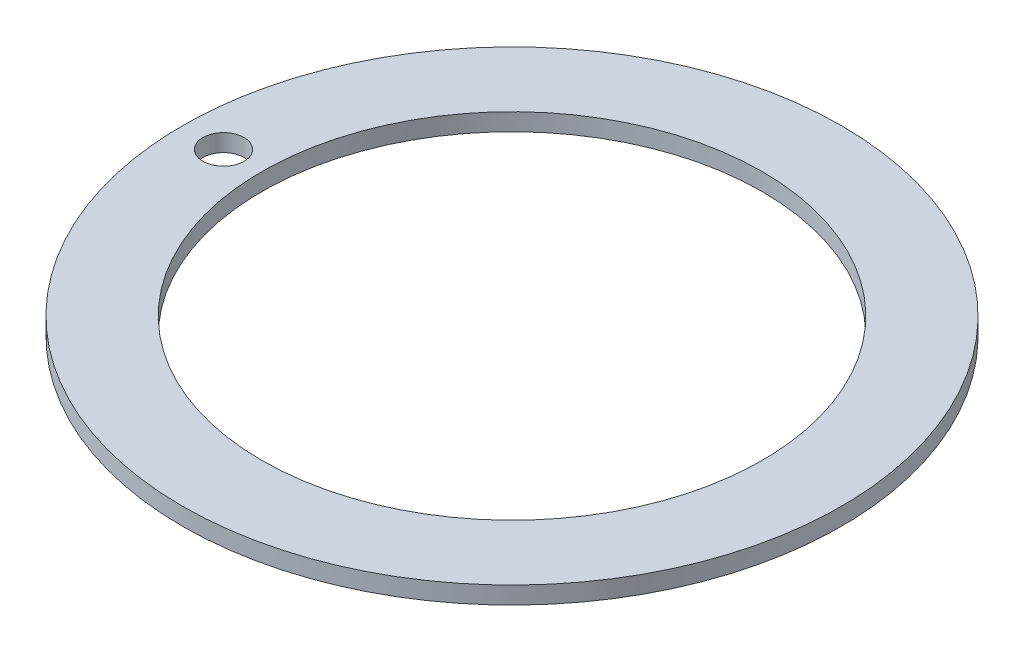
ISO-10303-21;
HEADER;
FILE_DESCRIPTION(('STEP AP214'),'2;1');
FILE_NAME('part.step','',(''),(''),'','','');
FILE_SCHEMA(('AUTOMOTIVE_DESIGN { 1 0 10303 214 1 1 1 1 }'));
ENDSEC;
DATA;
#1=APPLICATION_CONTEXT('core data for automotive mechanical design processes');
#2=APPLICATION_PROTOCOL_DEFINITION('international standard','automotive_design',2000,#1);
#3=PRODUCT_CONTEXT('',#1,'mechanical');
#4=PRODUCT('Part','Part','',(#3));
#5=PRODUCT_RELATED_PRODUCT_CATEGORY('part','',(#4));
#6=PRODUCT_DEFINITION_FORMATION('','',#4);
#7=PRODUCT_DEFINITION_CONTEXT('part definition',#1,'design');
#8=PRODUCT_DEFINITION('design','',#6,#7);
#9=PRODUCT_DEFINITION_SHAPE('','',#8);
#10=(LENGTH_UNIT() NAMED_UNIT(*) SI_UNIT(.MILLI.,.METRE.));
#11=(NAMED_UNIT(*) PLANE_ANGLE_UNIT() SI_UNIT($,.RADIAN.));
#12=(NAMED_UNIT(*) SI_UNIT($,.STERADIAN.) SOLID_ANGLE_UNIT());
#13=UNCERTAINTY_MEASURE_WITH_UNIT(LENGTH_MEASURE(1.E-05),#10,'distance_accuracy_value','');
#14=(GEOMETRIC_REPRESENTATION_CONTEXT(3) GLOBAL_UNCERTAINTY_ASSIGNED_CONTEXT((#13)) GLOBAL_UNIT_ASSIGNED_CONTEXT((#10,
#11,#12)) REPRESENTATION_CONTEXT('',''));
#15=CARTESIAN_POINT('',(0.,0.,0.));
#16=DIRECTION('',(0.,0.,1.));
#17=DIRECTION('',(1.,0.,0.));
#18=AXIS2_PLACEMENT_3D('',#15,#16,#17);
#19=CARTESIAN_POINT('',(0.,2.0066,0.));
#20=DIRECTION('',(0.,1.,0.));
#21=DIRECTION('',(0.,0.,1.));
#22=AXIS2_PLACEMENT_3D('',#19,#20,#21);
#23=PLANE('',#22);
#24=CARTESIAN_POINT('',(-33.3299411428324,2.0066,0.));
#25=DIRECTION('',(0.,1.,0.));
#26=DIRECTION('',(0.,0.,1.));
#27=AXIS2_PLACEMENT_3D('',#24,#25,#26);
#28=CIRCLE('',#27,2.38125);
#29=CARTESIAN_POINT('',(-33.3299411428324,2.0066,2.38125));
#30=VERTEX_POINT('',#29);
#31=EDGE_CURVE('E59',#30,#30,#28,.T.);
#32=ORIENTED_EDGE('',*,*,#31,.F.);
#33=EDGE_LOOP('',(#32));
#34=FACE_BOUND('',#33,.T.);
#35=CARTESIAN_POINT('',(0.,2.0066,0.));
#36=DIRECTION('',(0.,1.,0.));
#37=DIRECTION('',(0.,0.,1.));
#38=AXIS2_PLACEMENT_3D('',#35,#36,#37);
#39=CIRCLE('',#38,38.0746);
#40=CARTESIAN_POINT('',(0.,2.0066,38.0746));
#41=VERTEX_POINT('',#40);
#42=EDGE_CURVE('E10',#41,#41,#39,.T.);
#43=ORIENTED_EDGE('',*,*,#42,.T.);
#44=EDGE_LOOP('',(#43));
#45=FACE_BOUND('',#44,.T.);
#46=CARTESIAN_POINT('',(0.,2.0066,0.));
#47=DIRECTION('',(0.,1.,0.));
#48=DIRECTION('',(0.,0.,1.));
#49=AXIS2_PLACEMENT_3D('',#46,#47,#48);
#50=CIRCLE('',#49,28.9052);
#51=CARTESIAN_POINT('',(0.,2.0066,28.9052));
#52=VERTEX_POINT('',#51);
#53=EDGE_CURVE('E52',#52,#52,#50,.T.);
#54=ORIENTED_EDGE('',*,*,#53,.F.);
#55=EDGE_LOOP('',(#54));
#56=FACE_BOUND('',#55,.T.);
#57=ADVANCED_FACE('F39',(#34,#45,#56),#23,.T.);
#58=CARTESIAN_POINT('',(0.,0.,0.));
#59=DIRECTION('',(0.,1.,0.));
#60=DIRECTION('',(0.,0.,1.));
#61=AXIS2_PLACEMENT_3D('',#58,#59,#60);
#62=PLANE('',#61);
#63=CARTESIAN_POINT('',(-33.3299411428324,0.,0.));
#64=DIRECTION('',(0.,1.,0.));
#65=DIRECTION('',(0.,0.,1.));
#66=AXIS2_PLACEMENT_3D('',#63,#64,#65);
#67=CIRCLE('',#66,2.38125);
#68=CARTESIAN_POINT('',(-33.3299411428324,0.,2.38125));
#69=VERTEX_POINT('',#68);
#70=EDGE_CURVE('E43',#69,#69,#67,.T.);
#71=ORIENTED_EDGE('',*,*,#70,.T.);
#72=EDGE_LOOP('',(#71));
#73=FACE_BOUND('',#72,.T.);
#74=CARTESIAN_POINT('',(0.,0.,0.));
#75=DIRECTION('',(0.,1.,0.));
#76=DIRECTION('',(0.,0.,1.));
#77=AXIS2_PLACEMENT_3D('',#74,#75,#76);
#78=CIRCLE('',#77,38.0746);
#79=CARTESIAN_POINT('',(0.,0.,38.0746));
#80=VERTEX_POINT('',#79);
#81=EDGE_CURVE('E47',#80,#80,#78,.T.);
#82=ORIENTED_EDGE('',*,*,#81,.F.);
#83=EDGE_LOOP('',(#82));
#84=FACE_BOUND('',#83,.T.);
#85=CARTESIAN_POINT('',(0.,0.,0.));
#86=DIRECTION('',(0.,1.,0.));
#87=DIRECTION('',(0.,0.,1.));
#88=AXIS2_PLACEMENT_3D('',#85,#86,#87);
#89=CIRCLE('',#88,28.9052);
#90=CARTESIAN_POINT('',(0.,0.,28.9052));
#91=VERTEX_POINT('',#90);
#92=EDGE_CURVE('E54',#91,#91,#89,.T.);
#93=ORIENTED_EDGE('',*,*,#92,.T.);
#94=EDGE_LOOP('',(#93));
#95=FACE_BOUND('',#94,.T.);
#96=ADVANCED_FACE('F66',(#73,#84,#95),#62,.F.);
#97=CARTESIAN_POINT('',(0.,2.0066,0.));
#98=DIRECTION('',(0.,-1.,0.));
#99=DIRECTION('',(0.,0.,-1.));
#100=AXIS2_PLACEMENT_3D('',#97,#98,#99);
#101=CYLINDRICAL_SURFACE('',#100,38.0746);
#102=ORIENTED_EDGE('',*,*,#42,.F.);
#103=EDGE_LOOP('',(#102));
#104=FACE_BOUND('',#103,.T.);
#105=ORIENTED_EDGE('',*,*,#81,.T.);
#106=EDGE_LOOP('',(#105));
#107=FACE_BOUND('',#106,.T.);
#108=ADVANCED_FACE('F41',(#104,#107),#101,.T.);
#109=CARTESIAN_POINT('',(0.,2.0066,0.));
#110=DIRECTION('',(0.,-1.,0.));
#111=DIRECTION('',(0.,0.,-1.));
#112=AXIS2_PLACEMENT_3D('',#109,#110,#111);
#113=CYLINDRICAL_SURFACE('',#112,28.9052);
#114=ORIENTED_EDGE('',*,*,#53,.T.);
#115=EDGE_LOOP('',(#114));
#116=FACE_BOUND('',#115,.T.);
#117=ORIENTED_EDGE('',*,*,#92,.F.);
#118=EDGE_LOOP('',(#117));
#119=FACE_BOUND('',#118,.T.);
#120=ADVANCED_FACE('F71',(#116,#119),#113,.F.);
#121=CARTESIAN_POINT('',(-33.3299411428324,-0.5334,0.));
#122=DIRECTION('',(0.,1.,0.));
#123=DIRECTION('',(0.,0.,1.));
#124=AXIS2_PLACEMENT_3D('',#121,#122,#123);
#125=CYLINDRICAL_SURFACE('',#124,2.38125);
#126=ORIENTED_EDGE('',*,*,#31,.T.);
#127=EDGE_LOOP('',(#126));
#128=FACE_BOUND('',#127,.T.);
#129=ORIENTED_EDGE('',*,*,#70,.F.);
#130=EDGE_LOOP('',(#129));
#131=FACE_BOUND('',#130,.T.);
#132=ADVANCED_FACE('F69',(#128,#131),#125,.F.);
#133=CLOSED_SHELL('',(#57,#96,#108,#120,#132));
#134=MANIFOLD_SOLID_BREP('B2',#133);
#135=ADVANCED_BREP_SHAPE_REPRESENTATION('',(#18,#134),#14);
#136=SHAPE_DEFINITION_REPRESENTATION(#9,#135);
ENDSEC;
END-ISO-10303-21;
